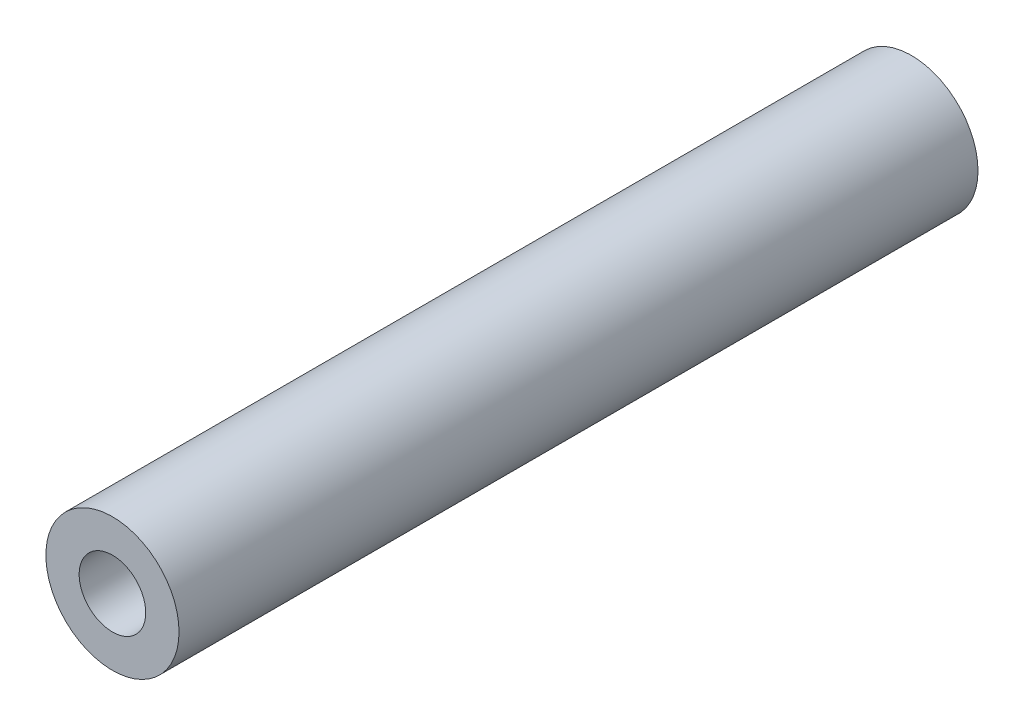
ISO-10303-21;
HEADER;
FILE_DESCRIPTION(('STEP AP214'),'2;1');
FILE_NAME('part.step','',(''),(''),'','','');
FILE_SCHEMA(('AUTOMOTIVE_DESIGN { 1 0 10303 214 1 1 1 1 }'));
ENDSEC;
DATA;
#1=APPLICATION_CONTEXT('core data for automotive mechanical design processes');
#2=APPLICATION_PROTOCOL_DEFINITION('international standard','automotive_design',2000,#1);
#3=PRODUCT_CONTEXT('',#1,'mechanical');
#4=PRODUCT('Part','Part','',(#3));
#5=PRODUCT_RELATED_PRODUCT_CATEGORY('part','',(#4));
#6=PRODUCT_DEFINITION_FORMATION('','',#4);
#7=PRODUCT_DEFINITION_CONTEXT('part definition',#1,'design');
#8=PRODUCT_DEFINITION('design','',#6,#7);
#9=PRODUCT_DEFINITION_SHAPE('','',#8);
#10=(LENGTH_UNIT() NAMED_UNIT(*) SI_UNIT(.MILLI.,.METRE.));
#11=(NAMED_UNIT(*) PLANE_ANGLE_UNIT() SI_UNIT($,.RADIAN.));
#12=(NAMED_UNIT(*) SI_UNIT($,.STERADIAN.) SOLID_ANGLE_UNIT());
#13=UNCERTAINTY_MEASURE_WITH_UNIT(LENGTH_MEASURE(1.E-05),#10,'distance_accuracy_value','');
#14=(GEOMETRIC_REPRESENTATION_CONTEXT(3) GLOBAL_UNCERTAINTY_ASSIGNED_CONTEXT((#13)) GLOBAL_UNIT_ASSIGNED_CONTEXT((#10,
#11,#12)) REPRESENTATION_CONTEXT('',''));
#15=CARTESIAN_POINT('',(0.,0.,0.));
#16=DIRECTION('',(0.,0.,1.));
#17=DIRECTION('',(1.,0.,0.));
#18=AXIS2_PLACEMENT_3D('',#15,#16,#17);
#19=CARTESIAN_POINT('',(0.,0.,60.));
#20=DIRECTION('',(0.,0.,1.));
#21=DIRECTION('',(1.,0.,0.));
#22=AXIS2_PLACEMENT_3D('',#19,#20,#21);
#23=PLANE('',#22);
#24=CARTESIAN_POINT('',(0.,0.,60.));
#25=DIRECTION('',(0.,0.,1.));
#26=DIRECTION('',(1.,0.,0.));
#27=AXIS2_PLACEMENT_3D('',#24,#25,#26);
#28=CIRCLE('',#27,5.);
#29=CARTESIAN_POINT('',(5.,0.,60.));
#30=VERTEX_POINT('',#29);
#31=EDGE_CURVE('E10',#30,#30,#28,.T.);
#32=ORIENTED_EDGE('',*,*,#31,.T.);
#33=EDGE_LOOP('',(#32));
#34=FACE_BOUND('',#33,.T.);
#35=CARTESIAN_POINT('',(0.,0.,60.));
#36=DIRECTION('',(0.,0.,1.));
#37=DIRECTION('',(1.,0.,0.));
#38=AXIS2_PLACEMENT_3D('',#35,#36,#37);
#39=CIRCLE('',#38,2.5);
#40=CARTESIAN_POINT('',(2.5,0.,60.));
#41=VERTEX_POINT('',#40);
#42=EDGE_CURVE('E57',#41,#41,#39,.T.);
#43=ORIENTED_EDGE('',*,*,#42,.F.);
#44=EDGE_LOOP('',(#43));
#45=FACE_BOUND('',#44,.T.);
#46=ADVANCED_FACE('F43',(#34,#45),#23,.T.);
#47=CARTESIAN_POINT('',(0.,0.,0.));
#48=DIRECTION('',(0.,0.,1.));
#49=DIRECTION('',(1.,0.,0.));
#50=AXIS2_PLACEMENT_3D('',#47,#48,#49);
#51=PLANE('',#50);
#52=CARTESIAN_POINT('',(0.,0.,0.));
#53=DIRECTION('',(0.,0.,1.));
#54=DIRECTION('',(1.,0.,0.));
#55=AXIS2_PLACEMENT_3D('',#52,#53,#54);
#56=CIRCLE('',#55,5.);
#57=CARTESIAN_POINT('',(5.,0.,0.));
#58=VERTEX_POINT('',#57);
#59=EDGE_CURVE('E50',#58,#58,#56,.T.);
#60=ORIENTED_EDGE('',*,*,#59,.F.);
#61=EDGE_LOOP('',(#60));
#62=FACE_BOUND('',#61,.T.);
#63=CARTESIAN_POINT('',(0.,0.,0.));
#64=DIRECTION('',(0.,0.,1.));
#65=DIRECTION('',(1.,0.,0.));
#66=AXIS2_PLACEMENT_3D('',#63,#64,#65);
#67=CIRCLE('',#66,2.5);
#68=CARTESIAN_POINT('',(2.5,0.,0.));
#69=VERTEX_POINT('',#68);
#70=EDGE_CURVE('E59',#69,#69,#67,.T.);
#71=ORIENTED_EDGE('',*,*,#70,.T.);
#72=EDGE_LOOP('',(#71));
#73=FACE_BOUND('',#72,.T.);
#74=ADVANCED_FACE('F68',(#62,#73),#51,.F.);
#75=CARTESIAN_POINT('',(0.,0.,60.));
#76=DIRECTION('',(0.,0.,-1.));
#77=DIRECTION('',(-1.,0.,0.));
#78=AXIS2_PLACEMENT_3D('',#75,#76,#77);
#79=CYLINDRICAL_SURFACE('',#78,5.);
#80=ORIENTED_EDGE('',*,*,#31,.F.);
#81=EDGE_LOOP('',(#80));
#82=FACE_BOUND('',#81,.T.);
#83=ORIENTED_EDGE('',*,*,#59,.T.);
#84=EDGE_LOOP('',(#83));
#85=FACE_BOUND('',#84,.T.);
#86=ADVANCED_FACE('F44',(#82,#85),#79,.T.);
#87=CARTESIAN_POINT('',(0.,0.,60.));
#88=DIRECTION('',(0.,0.,-1.));
#89=DIRECTION('',(-1.,0.,0.));
#90=AXIS2_PLACEMENT_3D('',#87,#88,#89);
#91=CYLINDRICAL_SURFACE('',#90,2.5);
#92=ORIENTED_EDGE('',*,*,#42,.T.);
#93=EDGE_LOOP('',(#92));
#94=FACE_BOUND('',#93,.T.);
#95=ORIENTED_EDGE('',*,*,#70,.F.);
#96=EDGE_LOOP('',(#95));
#97=FACE_BOUND('',#96,.T.);
#98=ADVANCED_FACE('F67',(#94,#97),#91,.F.);
#99=CLOSED_SHELL('',(#46,#74,#86,#98));
#100=MANIFOLD_SOLID_BREP('B2',#99);
#101=ADVANCED_BREP_SHAPE_REPRESENTATION('',(#18,#100),#14);
#102=SHAPE_DEFINITION_REPRESENTATION(#9,#101);
ENDSEC;
END-ISO-10303-21;
